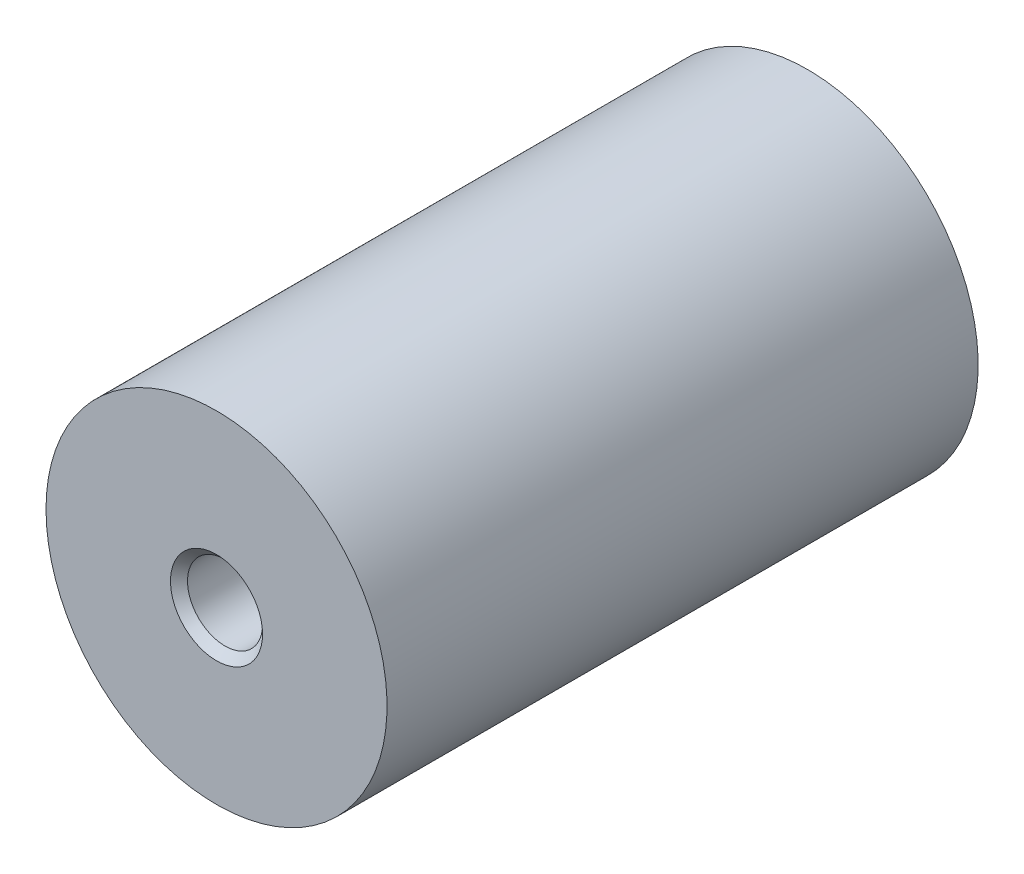
ISO-10303-21;
HEADER;
FILE_DESCRIPTION(('STEP AP214'),'2;1');
FILE_NAME('part.step','',(''),(''),'','','');
FILE_SCHEMA(('AUTOMOTIVE_DESIGN { 1 0 10303 214 1 1 1 1 }'));
ENDSEC;
DATA;
#1=APPLICATION_CONTEXT('core data for automotive mechanical design processes');
#2=APPLICATION_PROTOCOL_DEFINITION('international standard','automotive_design',2000,#1);
#3=PRODUCT_CONTEXT('',#1,'mechanical');
#4=PRODUCT('Part','Part','',(#3));
#5=PRODUCT_RELATED_PRODUCT_CATEGORY('part','',(#4));
#6=PRODUCT_DEFINITION_FORMATION('','',#4);
#7=PRODUCT_DEFINITION_CONTEXT('part definition',#1,'design');
#8=PRODUCT_DEFINITION('design','',#6,#7);
#9=PRODUCT_DEFINITION_SHAPE('','',#8);
#10=(LENGTH_UNIT() NAMED_UNIT(*) SI_UNIT(.MILLI.,.METRE.));
#11=(NAMED_UNIT(*) PLANE_ANGLE_UNIT() SI_UNIT($,.RADIAN.));
#12=(NAMED_UNIT(*) SI_UNIT($,.STERADIAN.) SOLID_ANGLE_UNIT());
#13=UNCERTAINTY_MEASURE_WITH_UNIT(LENGTH_MEASURE(1.E-05),#10,'distance_accuracy_value','');
#14=(GEOMETRIC_REPRESENTATION_CONTEXT(3) GLOBAL_UNCERTAINTY_ASSIGNED_CONTEXT((#13)) GLOBAL_UNIT_ASSIGNED_CONTEXT((#10,
#11,#12)) REPRESENTATION_CONTEXT('',''));
#15=CARTESIAN_POINT('',(0.,0.,0.));
#16=DIRECTION('',(0.,0.,1.));
#17=DIRECTION('',(1.,0.,0.));
#18=AXIS2_PLACEMENT_3D('',#15,#16,#17);
#19=CARTESIAN_POINT('',(0.,0.,13.));
#20=DIRECTION('',(0.,0.,-1.));
#21=DIRECTION('',(-1.,0.,0.));
#22=AXIS2_PLACEMENT_3D('',#19,#20,#21);
#23=CYLINDRICAL_SURFACE('',#22,7.5);
#24=CARTESIAN_POINT('',(0.,0.,13.));
#25=DIRECTION('',(0.,0.,1.));
#26=DIRECTION('',(1.,0.,0.));
#27=AXIS2_PLACEMENT_3D('',#24,#25,#26);
#28=CIRCLE('',#27,7.5);
#29=CARTESIAN_POINT('',(-7.5,0.,13.));
#30=VERTEX_POINT('',#29);
#31=EDGE_CURVE('E10',#30,#30,#28,.T.);
#32=CARTESIAN_POINT('',(0.,0.,-13.));
#33=DIRECTION('',(0.,0.,1.));
#34=DIRECTION('',(1.,0.,0.));
#35=AXIS2_PLACEMENT_3D('',#32,#33,#34);
#36=CIRCLE('',#35,7.5);
#37=CARTESIAN_POINT('',(-7.5,0.,-13.));
#38=VERTEX_POINT('',#37);
#39=EDGE_CURVE('E34',#38,#38,#36,.T.);
#40=CARTESIAN_POINT('',(-7.5,0.,13.));
#41=CARTESIAN_POINT('',(-7.5,0.,12.7291666666667));
#42=CARTESIAN_POINT('',(-7.5,0.,12.4583333333333));
#43=CARTESIAN_POINT('',(-7.5,0.,11.9166666666667));
#44=CARTESIAN_POINT('',(-7.5,0.,11.6458333333333));
#45=CARTESIAN_POINT('',(-7.5,0.,11.1041666666667));
#46=CARTESIAN_POINT('',(-7.5,0.,10.8333333333333));
#47=CARTESIAN_POINT('',(-7.5,0.,10.2916666666667));
#48=CARTESIAN_POINT('',(-7.5,0.,10.0208333333333));
#49=CARTESIAN_POINT('',(-7.5,0.,9.47916666666667));
#50=CARTESIAN_POINT('',(-7.5,0.,9.20833333333333));
#51=CARTESIAN_POINT('',(-7.5,0.,8.66666666666667));
#52=CARTESIAN_POINT('',(-7.5,0.,8.39583333333333));
#53=CARTESIAN_POINT('',(-7.5,0.,7.85416666666667));
#54=CARTESIAN_POINT('',(-7.5,0.,7.58333333333333));
#55=CARTESIAN_POINT('',(-7.5,0.,7.04166666666667));
#56=CARTESIAN_POINT('',(-7.5,0.,6.77083333333333));
#57=CARTESIAN_POINT('',(-7.5,0.,6.22916666666667));
#58=CARTESIAN_POINT('',(-7.5,0.,5.95833333333333));
#59=CARTESIAN_POINT('',(-7.5,0.,5.41666666666667));
#60=CARTESIAN_POINT('',(-7.5,0.,5.14583333333333));
#61=CARTESIAN_POINT('',(-7.5,0.,4.60416666666667));
#62=CARTESIAN_POINT('',(-7.5,0.,4.33333333333333));
#63=CARTESIAN_POINT('',(-7.5,0.,3.79166666666667));
#64=CARTESIAN_POINT('',(-7.5,0.,3.52083333333333));
#65=CARTESIAN_POINT('',(-7.5,0.,2.97916666666667));
#66=CARTESIAN_POINT('',(-7.5,0.,2.70833333333333));
#67=CARTESIAN_POINT('',(-7.5,0.,2.16666666666667));
#68=CARTESIAN_POINT('',(-7.5,0.,1.89583333333333));
#69=CARTESIAN_POINT('',(-7.5,0.,1.35416666666667));
#70=CARTESIAN_POINT('',(-7.5,0.,1.08333333333333));
#71=CARTESIAN_POINT('',(-7.5,0.,0.541666666666667));
#72=CARTESIAN_POINT('',(-7.5,0.,0.270833333333333));
#73=CARTESIAN_POINT('',(-7.5,0.,-0.270833333333333));
#74=CARTESIAN_POINT('',(-7.5,0.,-0.541666666666667));
#75=CARTESIAN_POINT('',(-7.5,0.,-1.08333333333333));
#76=CARTESIAN_POINT('',(-7.5,0.,-1.35416666666667));
#77=CARTESIAN_POINT('',(-7.5,0.,-1.89583333333333));
#78=CARTESIAN_POINT('',(-7.5,0.,-2.16666666666667));
#79=CARTESIAN_POINT('',(-7.5,0.,-2.70833333333333));
#80=CARTESIAN_POINT('',(-7.5,0.,-2.97916666666667));
#81=CARTESIAN_POINT('',(-7.5,0.,-3.52083333333333));
#82=CARTESIAN_POINT('',(-7.5,0.,-3.79166666666667));
#83=CARTESIAN_POINT('',(-7.5,0.,-4.33333333333333));
#84=CARTESIAN_POINT('',(-7.5,0.,-4.60416666666667));
#85=CARTESIAN_POINT('',(-7.5,0.,-5.14583333333333));
#86=CARTESIAN_POINT('',(-7.5,0.,-5.41666666666667));
#87=CARTESIAN_POINT('',(-7.5,0.,-5.95833333333333));
#88=CARTESIAN_POINT('',(-7.5,0.,-6.22916666666667));
#89=CARTESIAN_POINT('',(-7.5,0.,-6.77083333333333));
#90=CARTESIAN_POINT('',(-7.5,0.,-7.04166666666667));
#91=CARTESIAN_POINT('',(-7.5,0.,-7.58333333333333));
#92=CARTESIAN_POINT('',(-7.5,0.,-7.85416666666667));
#93=CARTESIAN_POINT('',(-7.5,0.,-8.39583333333333));
#94=CARTESIAN_POINT('',(-7.5,0.,-8.66666666666667));
#95=CARTESIAN_POINT('',(-7.5,0.,-9.20833333333333));
#96=CARTESIAN_POINT('',(-7.5,0.,-9.47916666666667));
#97=CARTESIAN_POINT('',(-7.5,0.,-10.0208333333333));
#98=CARTESIAN_POINT('',(-7.5,0.,-10.2916666666667));
#99=CARTESIAN_POINT('',(-7.5,0.,-10.8333333333333));
#100=CARTESIAN_POINT('',(-7.5,0.,-11.1041666666667));
#101=CARTESIAN_POINT('',(-7.5,0.,-11.6458333333333));
#102=CARTESIAN_POINT('',(-7.5,0.,-11.9166666666667));
#103=CARTESIAN_POINT('',(-7.5,0.,-12.4583333333333));
#104=CARTESIAN_POINT('',(-7.5,0.,-12.7291666666667));
#105=CARTESIAN_POINT('',(-7.5,0.,-13.));
#106=B_SPLINE_CURVE_WITH_KNOTS('',3,(#40,#41,#42,#43,#44,#45,#46,#47,#48,#49,#50,#51,#52,#53,
#54,#55,#56,#57,#58,#59,#60,#61,#62,#63,#64,#65,#66,#67,#68,#69,#70,#71,#72,#73,#74,#75,#76,#77,
#78,#79,#80,#81,#82,#83,#84,#85,#86,#87,#88,#89,#90,#91,#92,#93,#94,#95,#96,#97,#98,#99,#100,
#101,#102,#103,#104,#105),.UNSPECIFIED.,.F.,.F.,(4,2,2,2,2,2,2,2,2,2,2,2,2,2,2,2,2,2,2,2,2,2,2,
2,2,2,2,2,2,2,2,2,4),(0.,0.812500000000001,1.625,2.4375,3.25,4.0625,4.875,5.6875,6.5,7.3125,
8.125,8.9375,9.75,10.5625,11.375,12.1875,13.,13.8125,14.625,15.4375,16.25,17.0625,17.875,
18.6875,19.5,20.3125,21.125,21.9375,22.75,23.5625,24.375,25.1875,26.),.UNSPECIFIED.);
#107=EDGE_CURVE('BSEAM31',#30,#38,#106,.T.);
#108=ORIENTED_EDGE('',*,*,#31,.F.);
#109=ORIENTED_EDGE('',*,*,#39,.T.);
#110=ORIENTED_EDGE('',*,*,#107,.T.);
#111=ORIENTED_EDGE('',*,*,#107,.F.);
#112=EDGE_LOOP('',(#108,#110,#109,#111));
#113=FACE_BOUND('',#112,.T.);
#114=ADVANCED_FACE('F31',(#113),#23,.T.);
#115=CARTESIAN_POINT('',(0.,0.,13.));
#116=DIRECTION('',(0.,0.,1.));
#117=DIRECTION('',(1.,0.,0.));
#118=AXIS2_PLACEMENT_3D('',#115,#116,#117);
#119=PLANE('',#118);
#120=CARTESIAN_POINT('',(0.,0.,13.));
#121=DIRECTION('',(0.,0.,1.));
#122=DIRECTION('',(1.,0.,0.));
#123=AXIS2_PLACEMENT_3D('',#120,#121,#122);
#124=CIRCLE('',#123,2.025);
#125=CARTESIAN_POINT('',(2.025,0.,13.));
#126=VERTEX_POINT('',#125);
#127=EDGE_CURVE('E48',#126,#126,#124,.T.);
#128=ORIENTED_EDGE('',*,*,#127,.F.);
#129=EDGE_LOOP('',(#128));
#130=FACE_BOUND('',#129,.T.);
#131=ORIENTED_EDGE('',*,*,#31,.T.);
#132=EDGE_LOOP('',(#131));
#133=FACE_BOUND('',#132,.T.);
#134=ADVANCED_FACE('F54',(#130,#133),#119,.T.);
#135=CARTESIAN_POINT('',(0.,0.,-13.));
#136=DIRECTION('',(0.,0.,1.));
#137=DIRECTION('',(1.,0.,0.));
#138=AXIS2_PLACEMENT_3D('',#135,#136,#137);
#139=PLANE('',#138);
#140=CARTESIAN_POINT('',(0.,0.,-13.));
#141=DIRECTION('',(0.,0.,1.));
#142=DIRECTION('',(1.,0.,0.));
#143=AXIS2_PLACEMENT_3D('',#140,#141,#142);
#144=CIRCLE('',#143,1.65);
#145=CARTESIAN_POINT('',(1.65,0.,-13.));
#146=VERTEX_POINT('',#145);
#147=EDGE_CURVE('E41',#146,#146,#144,.T.);
#148=ORIENTED_EDGE('',*,*,#147,.T.);
#149=EDGE_LOOP('',(#148));
#150=FACE_BOUND('',#149,.T.);
#151=ORIENTED_EDGE('',*,*,#39,.F.);
#152=EDGE_LOOP('',(#151));
#153=FACE_BOUND('',#152,.T.);
#154=ADVANCED_FACE('F56',(#150,#153),#139,.F.);
#155=CARTESIAN_POINT('',(0.,0.,13.));
#156=DIRECTION('',(0.,0.,1.));
#157=DIRECTION('',(1.,0.,0.));
#158=AXIS2_PLACEMENT_3D('',#155,#156,#157);
#159=CYLINDRICAL_SURFACE('',#158,1.65);
#160=ORIENTED_EDGE('',*,*,#147,.F.);
#161=EDGE_LOOP('',(#160));
#162=FACE_BOUND('',#161,.T.);
#163=CARTESIAN_POINT('',(0.,0.,12.625));
#164=DIRECTION('',(0.,0.,1.));
#165=DIRECTION('',(1.,0.,0.));
#166=AXIS2_PLACEMENT_3D('',#163,#164,#165);
#167=CIRCLE('',#166,1.65);
#168=CARTESIAN_POINT('',(1.65,0.,12.625));
#169=VERTEX_POINT('',#168);
#170=EDGE_CURVE('E45',#169,#169,#167,.T.);
#171=ORIENTED_EDGE('',*,*,#170,.T.);
#172=EDGE_LOOP('',(#171));
#173=FACE_BOUND('',#172,.T.);
#174=ADVANCED_FACE('F62',(#162,#173),#159,.F.);
#175=CARTESIAN_POINT('',(0.,0.,13.));
#176=DIRECTION('',(0.,0.,1.));
#177=DIRECTION('',(1.,0.,0.));
#178=AXIS2_PLACEMENT_3D('',#175,#176,#177);
#179=CONICAL_SURFACE('',#178,2.025,0.785398163397446);
#180=ORIENTED_EDGE('',*,*,#170,.F.);
#181=EDGE_LOOP('',(#180));
#182=FACE_BOUND('',#181,.T.);
#183=ORIENTED_EDGE('',*,*,#127,.T.);
#184=EDGE_LOOP('',(#183));
#185=FACE_BOUND('',#184,.T.);
#186=ADVANCED_FACE('F52',(#182,#185),#179,.F.);
#187=CLOSED_SHELL('',(#114,#134,#154,#174,#186));
#188=MANIFOLD_SOLID_BREP('B2',#187);
#189=ADVANCED_BREP_SHAPE_REPRESENTATION('',(#18,#188),#14);
#190=SHAPE_DEFINITION_REPRESENTATION(#9,#189);
ENDSEC;
END-ISO-10303-21;
